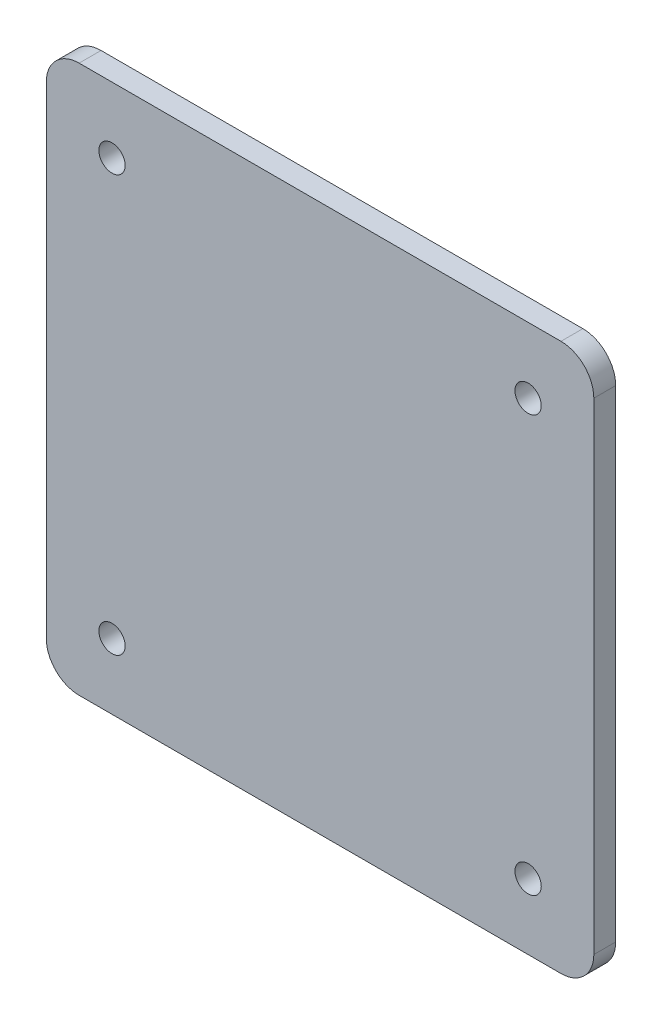
ISO-10303-21;
HEADER;
FILE_DESCRIPTION(('STEP AP214'),'2;1');
FILE_NAME('part.step','',(''),(''),'','','');
FILE_SCHEMA(('AUTOMOTIVE_DESIGN { 1 0 10303 214 1 1 1 1 }'));
ENDSEC;
DATA;
#1=APPLICATION_CONTEXT('core data for automotive mechanical design processes');
#2=APPLICATION_PROTOCOL_DEFINITION('international standard','automotive_design',2000,#1);
#3=PRODUCT_CONTEXT('',#1,'mechanical');
#4=PRODUCT('Part','Part','',(#3));
#5=PRODUCT_RELATED_PRODUCT_CATEGORY('part','',(#4));
#6=PRODUCT_DEFINITION_FORMATION('','',#4);
#7=PRODUCT_DEFINITION_CONTEXT('part definition',#1,'design');
#8=PRODUCT_DEFINITION('design','',#6,#7);
#9=PRODUCT_DEFINITION_SHAPE('','',#8);
#10=(LENGTH_UNIT() NAMED_UNIT(*) SI_UNIT(.MILLI.,.METRE.));
#11=(NAMED_UNIT(*) PLANE_ANGLE_UNIT() SI_UNIT($,.RADIAN.));
#12=(NAMED_UNIT(*) SI_UNIT($,.STERADIAN.) SOLID_ANGLE_UNIT());
#13=UNCERTAINTY_MEASURE_WITH_UNIT(LENGTH_MEASURE(1.E-05),#10,'distance_accuracy_value','');
#14=(GEOMETRIC_REPRESENTATION_CONTEXT(3) GLOBAL_UNCERTAINTY_ASSIGNED_CONTEXT((#13)) GLOBAL_UNIT_ASSIGNED_CONTEXT((#10,
#11,#12)) REPRESENTATION_CONTEXT('',''));
#15=CARTESIAN_POINT('',(0.,0.,0.));
#16=DIRECTION('',(0.,0.,1.));
#17=DIRECTION('',(1.,0.,0.));
#18=AXIS2_PLACEMENT_3D('',#15,#16,#17);
#19=CARTESIAN_POINT('',(110.,110.,10.));
#20=DIRECTION('',(0.,0.,-1.));
#21=DIRECTION('',(-1.,0.,0.));
#22=AXIS2_PLACEMENT_3D('',#19,#20,#21);
#23=PLANE('',#22);
#24=CARTESIAN_POINT('',(110.,110.,10.));
#25=DIRECTION('',(0.,0.,1.));
#26=DIRECTION('',(-1.,0.,0.));
#27=AXIS2_PLACEMENT_3D('',#24,#25,#26);
#28=CIRCLE('',#27,15.);
#29=CARTESIAN_POINT('',(125.,110.,10.));
#30=VERTEX_POINT('',#29);
#31=CARTESIAN_POINT('',(110.,125.,10.));
#32=VERTEX_POINT('',#31);
#33=EDGE_CURVE('E145',#30,#32,#28,.T.);
#34=ORIENTED_EDGE('',*,*,#33,.T.);
#35=DIRECTION('',(-1.,0.,0.));
#36=VECTOR('',#35,1.);
#37=CARTESIAN_POINT('',(-110.,125.,10.));
#38=LINE('',#37,#36);
#39=CARTESIAN_POINT('',(-110.,125.,10.));
#40=VERTEX_POINT('',#39);
#41=EDGE_CURVE('E93',#32,#40,#38,.T.);
#42=ORIENTED_EDGE('',*,*,#41,.T.);
#43=CARTESIAN_POINT('',(-110.,110.,10.));
#44=DIRECTION('',(0.,0.,1.));
#45=DIRECTION('',(1.,0.,0.));
#46=AXIS2_PLACEMENT_3D('',#43,#44,#45);
#47=CIRCLE('',#46,15.);
#48=CARTESIAN_POINT('',(-125.,110.,10.));
#49=VERTEX_POINT('',#48);
#50=EDGE_CURVE('E160',#40,#49,#47,.T.);
#51=ORIENTED_EDGE('',*,*,#50,.T.);
#52=DIRECTION('',(0.,-1.,0.));
#53=VECTOR('',#52,1.);
#54=CARTESIAN_POINT('',(-125.,110.,10.));
#55=LINE('',#54,#53);
#56=CARTESIAN_POINT('',(-125.,-110.,10.));
#57=VERTEX_POINT('',#56);
#58=EDGE_CURVE('E173',#49,#57,#55,.T.);
#59=ORIENTED_EDGE('',*,*,#58,.T.);
#60=CARTESIAN_POINT('',(-110.,-110.,10.));
#61=DIRECTION('',(0.,0.,1.));
#62=DIRECTION('',(1.,0.,0.));
#63=AXIS2_PLACEMENT_3D('',#60,#61,#62);
#64=CIRCLE('',#63,15.);
#65=CARTESIAN_POINT('',(-110.,-125.,10.));
#66=VERTEX_POINT('',#65);
#67=EDGE_CURVE('E112',#57,#66,#64,.T.);
#68=ORIENTED_EDGE('',*,*,#67,.T.);
#69=DIRECTION('',(1.,0.,0.));
#70=VECTOR('',#69,1.);
#71=CARTESIAN_POINT('',(-110.,-125.,10.));
#72=LINE('',#71,#70);
#73=CARTESIAN_POINT('',(110.,-125.,10.));
#74=VERTEX_POINT('',#73);
#75=EDGE_CURVE('E106',#66,#74,#72,.T.);
#76=ORIENTED_EDGE('',*,*,#75,.T.);
#77=CARTESIAN_POINT('',(110.,-110.,10.));
#78=DIRECTION('',(0.,0.,1.));
#79=DIRECTION('',(1.,0.,0.));
#80=AXIS2_PLACEMENT_3D('',#77,#78,#79);
#81=CIRCLE('',#80,15.);
#82=CARTESIAN_POINT('',(125.,-110.,10.));
#83=VERTEX_POINT('',#82);
#84=EDGE_CURVE('E110',#74,#83,#81,.T.);
#85=ORIENTED_EDGE('',*,*,#84,.T.);
#86=DIRECTION('',(0.,1.,0.));
#87=VECTOR('',#86,1.);
#88=CARTESIAN_POINT('',(125.,110.,10.));
#89=LINE('',#88,#87);
#90=EDGE_CURVE('E50',#83,#30,#89,.T.);
#91=ORIENTED_EDGE('',*,*,#90,.T.);
#92=EDGE_LOOP('',(#34,#42,#51,#59,#68,#76,#85,#91));
#93=FACE_BOUND('',#92,.T.);
#94=CARTESIAN_POINT('',(-95.,95.,10.));
#95=DIRECTION('',(0.,0.,1.));
#96=DIRECTION('',(1.,0.,0.));
#97=AXIS2_PLACEMENT_3D('',#94,#95,#96);
#98=CIRCLE('',#97,6.);
#99=CARTESIAN_POINT('',(-89.,95.,10.));
#100=VERTEX_POINT('',#99);
#101=EDGE_CURVE('E134',#100,#100,#98,.T.);
#102=ORIENTED_EDGE('',*,*,#101,.F.);
#103=EDGE_LOOP('',(#102));
#104=FACE_BOUND('',#103,.T.);
#105=CARTESIAN_POINT('',(-95.,-95.,10.));
#106=DIRECTION('',(0.,0.,1.));
#107=DIRECTION('',(1.,0.,0.));
#108=AXIS2_PLACEMENT_3D('',#105,#106,#107);
#109=CIRCLE('',#108,6.);
#110=CARTESIAN_POINT('',(-89.,-95.,10.));
#111=VERTEX_POINT('',#110);
#112=EDGE_CURVE('E182',#111,#111,#109,.T.);
#113=ORIENTED_EDGE('',*,*,#112,.F.);
#114=EDGE_LOOP('',(#113));
#115=FACE_BOUND('',#114,.T.);
#116=CARTESIAN_POINT('',(95.,-95.,10.));
#117=DIRECTION('',(0.,0.,1.));
#118=DIRECTION('',(1.,0.,0.));
#119=AXIS2_PLACEMENT_3D('',#116,#117,#118);
#120=CIRCLE('',#119,6.);
#121=CARTESIAN_POINT('',(101.,-95.,10.));
#122=VERTEX_POINT('',#121);
#123=EDGE_CURVE('E188',#122,#122,#120,.T.);
#124=ORIENTED_EDGE('',*,*,#123,.F.);
#125=EDGE_LOOP('',(#124));
#126=FACE_BOUND('',#125,.T.);
#127=CARTESIAN_POINT('',(95.,95.,10.));
#128=DIRECTION('',(0.,0.,1.));
#129=DIRECTION('',(1.,0.,0.));
#130=AXIS2_PLACEMENT_3D('',#127,#128,#129);
#131=CIRCLE('',#130,6.);
#132=CARTESIAN_POINT('',(101.,95.,10.));
#133=VERTEX_POINT('',#132);
#134=EDGE_CURVE('E194',#133,#133,#131,.T.);
#135=ORIENTED_EDGE('',*,*,#134,.F.);
#136=EDGE_LOOP('',(#135));
#137=FACE_BOUND('',#136,.T.);
#138=ADVANCED_FACE('F33',(#93,#104,#115,#126,#137),#23,.F.);
#139=CARTESIAN_POINT('',(110.,110.,0.));
#140=DIRECTION('',(0.,0.,-1.));
#141=DIRECTION('',(-1.,0.,0.));
#142=AXIS2_PLACEMENT_3D('',#139,#140,#141);
#143=PLANE('',#142);
#144=CARTESIAN_POINT('',(95.,-95.,0.));
#145=DIRECTION('',(0.,0.,1.));
#146=DIRECTION('',(1.,0.,0.));
#147=AXIS2_PLACEMENT_3D('',#144,#145,#146);
#148=CIRCLE('',#147,6.);
#149=CARTESIAN_POINT('',(101.,-95.,0.));
#150=VERTEX_POINT('',#149);
#151=EDGE_CURVE('E191',#150,#150,#148,.T.);
#152=ORIENTED_EDGE('',*,*,#151,.T.);
#153=EDGE_LOOP('',(#152));
#154=FACE_BOUND('',#153,.T.);
#155=CARTESIAN_POINT('',(-95.,95.,0.));
#156=DIRECTION('',(0.,0.,1.));
#157=DIRECTION('',(1.,0.,0.));
#158=AXIS2_PLACEMENT_3D('',#155,#156,#157);
#159=CIRCLE('',#158,6.);
#160=CARTESIAN_POINT('',(-89.,95.,0.));
#161=VERTEX_POINT('',#160);
#162=EDGE_CURVE('E179',#161,#161,#159,.T.);
#163=ORIENTED_EDGE('',*,*,#162,.T.);
#164=EDGE_LOOP('',(#163));
#165=FACE_BOUND('',#164,.T.);
#166=CARTESIAN_POINT('',(110.,110.,0.));
#167=DIRECTION('',(0.,0.,1.));
#168=DIRECTION('',(-1.,0.,0.));
#169=AXIS2_PLACEMENT_3D('',#166,#167,#168);
#170=CIRCLE('',#169,15.);
#171=CARTESIAN_POINT('',(125.,110.,0.));
#172=VERTEX_POINT('',#171);
#173=CARTESIAN_POINT('',(110.,125.,0.));
#174=VERTEX_POINT('',#173);
#175=EDGE_CURVE('E130',#172,#174,#170,.T.);
#176=ORIENTED_EDGE('',*,*,#175,.F.);
#177=DIRECTION('',(0.,1.,0.));
#178=VECTOR('',#177,1.);
#179=CARTESIAN_POINT('',(125.,110.,0.));
#180=LINE('',#179,#178);
#181=CARTESIAN_POINT('',(125.,-110.,0.));
#182=VERTEX_POINT('',#181);
#183=EDGE_CURVE('E85',#182,#172,#180,.T.);
#184=ORIENTED_EDGE('',*,*,#183,.F.);
#185=CARTESIAN_POINT('',(110.,-110.,0.));
#186=DIRECTION('',(0.,0.,1.));
#187=DIRECTION('',(1.,0.,0.));
#188=AXIS2_PLACEMENT_3D('',#185,#186,#187);
#189=CIRCLE('',#188,15.);
#190=CARTESIAN_POINT('',(110.,-125.,0.));
#191=VERTEX_POINT('',#190);
#192=EDGE_CURVE('E79',#191,#182,#189,.T.);
#193=ORIENTED_EDGE('',*,*,#192,.F.);
#194=DIRECTION('',(1.,0.,0.));
#195=VECTOR('',#194,1.);
#196=CARTESIAN_POINT('',(-110.,-125.,0.));
#197=LINE('',#196,#195);
#198=CARTESIAN_POINT('',(-110.,-125.,0.));
#199=VERTEX_POINT('',#198);
#200=EDGE_CURVE('E120',#199,#191,#197,.T.);
#201=ORIENTED_EDGE('',*,*,#200,.F.);
#202=CARTESIAN_POINT('',(-110.,-110.,0.));
#203=DIRECTION('',(0.,0.,1.));
#204=DIRECTION('',(1.,0.,0.));
#205=AXIS2_PLACEMENT_3D('',#202,#203,#204);
#206=CIRCLE('',#205,15.);
#207=CARTESIAN_POINT('',(-125.,-110.,0.));
#208=VERTEX_POINT('',#207);
#209=EDGE_CURVE('E140',#208,#199,#206,.T.);
#210=ORIENTED_EDGE('',*,*,#209,.F.);
#211=DIRECTION('',(0.,-1.,0.));
#212=VECTOR('',#211,1.);
#213=CARTESIAN_POINT('',(-125.,110.,0.));
#214=LINE('',#213,#212);
#215=CARTESIAN_POINT('',(-125.,110.,0.));
#216=VERTEX_POINT('',#215);
#217=EDGE_CURVE('E138',#216,#208,#214,.T.);
#218=ORIENTED_EDGE('',*,*,#217,.F.);
#219=CARTESIAN_POINT('',(-110.,110.,0.));
#220=DIRECTION('',(0.,0.,1.));
#221=DIRECTION('',(1.,0.,0.));
#222=AXIS2_PLACEMENT_3D('',#219,#220,#221);
#223=CIRCLE('',#222,15.);
#224=CARTESIAN_POINT('',(-110.,125.,0.));
#225=VERTEX_POINT('',#224);
#226=EDGE_CURVE('E136',#225,#216,#223,.T.);
#227=ORIENTED_EDGE('',*,*,#226,.F.);
#228=DIRECTION('',(-1.,0.,0.));
#229=VECTOR('',#228,1.);
#230=CARTESIAN_POINT('',(-110.,125.,0.));
#231=LINE('',#230,#229);
#232=EDGE_CURVE('E133',#174,#225,#231,.T.);
#233=ORIENTED_EDGE('',*,*,#232,.F.);
#234=EDGE_LOOP('',(#176,#184,#193,#201,#210,#218,#227,#233));
#235=FACE_BOUND('',#234,.T.);
#236=CARTESIAN_POINT('',(-95.,-95.,0.));
#237=DIRECTION('',(0.,0.,1.));
#238=DIRECTION('',(1.,0.,0.));
#239=AXIS2_PLACEMENT_3D('',#236,#237,#238);
#240=CIRCLE('',#239,6.);
#241=CARTESIAN_POINT('',(-89.,-95.,0.));
#242=VERTEX_POINT('',#241);
#243=EDGE_CURVE('E185',#242,#242,#240,.T.);
#244=ORIENTED_EDGE('',*,*,#243,.T.);
#245=EDGE_LOOP('',(#244));
#246=FACE_BOUND('',#245,.T.);
#247=CARTESIAN_POINT('',(95.,95.,0.));
#248=DIRECTION('',(0.,0.,1.));
#249=DIRECTION('',(1.,0.,0.));
#250=AXIS2_PLACEMENT_3D('',#247,#248,#249);
#251=CIRCLE('',#250,6.);
#252=CARTESIAN_POINT('',(101.,95.,0.));
#253=VERTEX_POINT('',#252);
#254=EDGE_CURVE('E197',#253,#253,#251,.T.);
#255=ORIENTED_EDGE('',*,*,#254,.T.);
#256=EDGE_LOOP('',(#255));
#257=FACE_BOUND('',#256,.T.);
#258=ADVANCED_FACE('F164',(#154,#165,#235,#246,#257),#143,.T.);
#259=CARTESIAN_POINT('',(110.,110.,10.));
#260=DIRECTION('',(0.,0.,-1.));
#261=DIRECTION('',(-1.,0.,0.));
#262=AXIS2_PLACEMENT_3D('',#259,#260,#261);
#263=CYLINDRICAL_SURFACE('',#262,15.);
#264=ORIENTED_EDGE('',*,*,#175,.T.);
#265=DIRECTION('',(0.,0.,-1.));
#266=VECTOR('',#265,1.);
#267=CARTESIAN_POINT('',(110.,125.,10.));
#268=LINE('',#267,#266);
#269=EDGE_CURVE('E11',#32,#174,#268,.T.);
#270=ORIENTED_EDGE('',*,*,#269,.F.);
#271=ORIENTED_EDGE('',*,*,#33,.F.);
#272=DIRECTION('',(0.,0.,-1.));
#273=VECTOR('',#272,1.);
#274=CARTESIAN_POINT('',(125.,110.,10.));
#275=LINE('',#274,#273);
#276=EDGE_CURVE('E126',#30,#172,#275,.T.);
#277=ORIENTED_EDGE('',*,*,#276,.T.);
#278=EDGE_LOOP('',(#264,#270,#271,#277));
#279=FACE_BOUND('',#278,.T.);
#280=ADVANCED_FACE('F35',(#279),#263,.T.);
#281=CARTESIAN_POINT('',(-110.,125.,10.));
#282=DIRECTION('',(0.,-1.,0.));
#283=DIRECTION('',(0.,0.,-1.));
#284=AXIS2_PLACEMENT_3D('',#281,#282,#283);
#285=PLANE('',#284);
#286=ORIENTED_EDGE('',*,*,#232,.T.);
#287=DIRECTION('',(0.,0.,-1.));
#288=VECTOR('',#287,1.);
#289=CARTESIAN_POINT('',(-110.,125.,10.));
#290=LINE('',#289,#288);
#291=EDGE_CURVE('E42',#40,#225,#290,.T.);
#292=ORIENTED_EDGE('',*,*,#291,.F.);
#293=ORIENTED_EDGE('',*,*,#41,.F.);
#294=ORIENTED_EDGE('',*,*,#269,.T.);
#295=EDGE_LOOP('',(#286,#292,#293,#294));
#296=FACE_BOUND('',#295,.T.);
#297=ADVANCED_FACE('F229',(#296),#285,.F.);
#298=CARTESIAN_POINT('',(-110.,110.,10.));
#299=DIRECTION('',(0.,0.,-1.));
#300=DIRECTION('',(-1.,0.,0.));
#301=AXIS2_PLACEMENT_3D('',#298,#299,#300);
#302=CYLINDRICAL_SURFACE('',#301,15.);
#303=ORIENTED_EDGE('',*,*,#226,.T.);
#304=DIRECTION('',(0.,0.,-1.));
#305=VECTOR('',#304,1.);
#306=CARTESIAN_POINT('',(-125.,110.,10.));
#307=LINE('',#306,#305);
#308=EDGE_CURVE('E152',#49,#216,#307,.T.);
#309=ORIENTED_EDGE('',*,*,#308,.F.);
#310=ORIENTED_EDGE('',*,*,#50,.F.);
#311=ORIENTED_EDGE('',*,*,#291,.T.);
#312=EDGE_LOOP('',(#303,#309,#310,#311));
#313=FACE_BOUND('',#312,.T.);
#314=ADVANCED_FACE('F158',(#313),#302,.T.);
#315=CARTESIAN_POINT('',(-125.,110.,10.));
#316=DIRECTION('',(1.,0.,0.));
#317=DIRECTION('',(0.,1.,0.));
#318=AXIS2_PLACEMENT_3D('',#315,#316,#317);
#319=PLANE('',#318);
#320=ORIENTED_EDGE('',*,*,#217,.T.);
#321=DIRECTION('',(0.,0.,-1.));
#322=VECTOR('',#321,1.);
#323=CARTESIAN_POINT('',(-125.,-110.,10.));
#324=LINE('',#323,#322);
#325=EDGE_CURVE('E149',#57,#208,#324,.T.);
#326=ORIENTED_EDGE('',*,*,#325,.F.);
#327=ORIENTED_EDGE('',*,*,#58,.F.);
#328=ORIENTED_EDGE('',*,*,#308,.T.);
#329=EDGE_LOOP('',(#320,#326,#327,#328));
#330=FACE_BOUND('',#329,.T.);
#331=ADVANCED_FACE('F169',(#330),#319,.F.);
#332=CARTESIAN_POINT('',(-110.,-110.,10.));
#333=DIRECTION('',(0.,0.,-1.));
#334=DIRECTION('',(-1.,0.,0.));
#335=AXIS2_PLACEMENT_3D('',#332,#333,#334);
#336=CYLINDRICAL_SURFACE('',#335,15.);
#337=ORIENTED_EDGE('',*,*,#209,.T.);
#338=DIRECTION('',(0.,0.,-1.));
#339=VECTOR('',#338,1.);
#340=CARTESIAN_POINT('',(-110.,-125.,10.));
#341=LINE('',#340,#339);
#342=EDGE_CURVE('E121',#66,#199,#341,.T.);
#343=ORIENTED_EDGE('',*,*,#342,.F.);
#344=ORIENTED_EDGE('',*,*,#67,.F.);
#345=ORIENTED_EDGE('',*,*,#325,.T.);
#346=EDGE_LOOP('',(#337,#343,#344,#345));
#347=FACE_BOUND('',#346,.T.);
#348=ADVANCED_FACE('F172',(#347),#336,.T.);
#349=CARTESIAN_POINT('',(-110.,-125.,10.));
#350=DIRECTION('',(0.,1.,0.));
#351=DIRECTION('',(0.,0.,1.));
#352=AXIS2_PLACEMENT_3D('',#349,#350,#351);
#353=PLANE('',#352);
#354=ORIENTED_EDGE('',*,*,#200,.T.);
#355=DIRECTION('',(0.,0.,-1.));
#356=VECTOR('',#355,1.);
#357=CARTESIAN_POINT('',(110.,-125.,10.));
#358=LINE('',#357,#356);
#359=EDGE_CURVE('E117',#74,#191,#358,.T.);
#360=ORIENTED_EDGE('',*,*,#359,.F.);
#361=ORIENTED_EDGE('',*,*,#75,.F.);
#362=ORIENTED_EDGE('',*,*,#342,.T.);
#363=EDGE_LOOP('',(#354,#360,#361,#362));
#364=FACE_BOUND('',#363,.T.);
#365=ADVANCED_FACE('F118',(#364),#353,.F.);
#366=CARTESIAN_POINT('',(110.,-110.,10.));
#367=DIRECTION('',(0.,0.,-1.));
#368=DIRECTION('',(-1.,0.,0.));
#369=AXIS2_PLACEMENT_3D('',#366,#367,#368);
#370=CYLINDRICAL_SURFACE('',#369,15.);
#371=ORIENTED_EDGE('',*,*,#192,.T.);
#372=DIRECTION('',(0.,0.,-1.));
#373=VECTOR('',#372,1.);
#374=CARTESIAN_POINT('',(125.,-110.,10.));
#375=LINE('',#374,#373);
#376=EDGE_CURVE('E122',#83,#182,#375,.T.);
#377=ORIENTED_EDGE('',*,*,#376,.F.);
#378=ORIENTED_EDGE('',*,*,#84,.F.);
#379=ORIENTED_EDGE('',*,*,#359,.T.);
#380=EDGE_LOOP('',(#371,#377,#378,#379));
#381=FACE_BOUND('',#380,.T.);
#382=ADVANCED_FACE('F124',(#381),#370,.T.);
#383=CARTESIAN_POINT('',(125.,110.,10.));
#384=DIRECTION('',(-1.,0.,0.));
#385=DIRECTION('',(0.,-1.,0.));
#386=AXIS2_PLACEMENT_3D('',#383,#384,#385);
#387=PLANE('',#386);
#388=ORIENTED_EDGE('',*,*,#183,.T.);
#389=ORIENTED_EDGE('',*,*,#276,.F.);
#390=ORIENTED_EDGE('',*,*,#90,.F.);
#391=ORIENTED_EDGE('',*,*,#376,.T.);
#392=EDGE_LOOP('',(#388,#389,#390,#391));
#393=FACE_BOUND('',#392,.T.);
#394=ADVANCED_FACE('F217',(#393),#387,.F.);
#395=CARTESIAN_POINT('',(-95.,95.,10.));
#396=DIRECTION('',(0.,0.,-1.));
#397=DIRECTION('',(-1.,0.,0.));
#398=AXIS2_PLACEMENT_3D('',#395,#396,#397);
#399=CYLINDRICAL_SURFACE('',#398,6.);
#400=ORIENTED_EDGE('',*,*,#101,.T.);
#401=EDGE_LOOP('',(#400));
#402=FACE_BOUND('',#401,.T.);
#403=ORIENTED_EDGE('',*,*,#162,.F.);
#404=EDGE_LOOP('',(#403));
#405=FACE_BOUND('',#404,.T.);
#406=ADVANCED_FACE('F214',(#402,#405),#399,.F.);
#407=CARTESIAN_POINT('',(-95.,-95.,10.));
#408=DIRECTION('',(0.,0.,-1.));
#409=DIRECTION('',(-1.,0.,0.));
#410=AXIS2_PLACEMENT_3D('',#407,#408,#409);
#411=CYLINDRICAL_SURFACE('',#410,6.);
#412=ORIENTED_EDGE('',*,*,#112,.T.);
#413=EDGE_LOOP('',(#412));
#414=FACE_BOUND('',#413,.T.);
#415=ORIENTED_EDGE('',*,*,#243,.F.);
#416=EDGE_LOOP('',(#415));
#417=FACE_BOUND('',#416,.T.);
#418=ADVANCED_FACE('F293',(#414,#417),#411,.F.);
#419=CARTESIAN_POINT('',(95.,-95.,10.));
#420=DIRECTION('',(0.,0.,-1.));
#421=DIRECTION('',(-1.,0.,0.));
#422=AXIS2_PLACEMENT_3D('',#419,#420,#421);
#423=CYLINDRICAL_SURFACE('',#422,6.);
#424=ORIENTED_EDGE('',*,*,#123,.T.);
#425=EDGE_LOOP('',(#424));
#426=FACE_BOUND('',#425,.T.);
#427=ORIENTED_EDGE('',*,*,#151,.F.);
#428=EDGE_LOOP('',(#427));
#429=FACE_BOUND('',#428,.T.);
#430=ADVANCED_FACE('F301',(#426,#429),#423,.F.);
#431=CARTESIAN_POINT('',(95.,95.,10.));
#432=DIRECTION('',(0.,0.,-1.));
#433=DIRECTION('',(-1.,0.,0.));
#434=AXIS2_PLACEMENT_3D('',#431,#432,#433);
#435=CYLINDRICAL_SURFACE('',#434,6.);
#436=ORIENTED_EDGE('',*,*,#134,.T.);
#437=EDGE_LOOP('',(#436));
#438=FACE_BOUND('',#437,.T.);
#439=ORIENTED_EDGE('',*,*,#254,.F.);
#440=EDGE_LOOP('',(#439));
#441=FACE_BOUND('',#440,.T.);
#442=ADVANCED_FACE('F203',(#438,#441),#435,.F.);
#443=CLOSED_SHELL('',(#138,#258,#280,#297,#314,#331,#348,#365,#382,#394,#406,#418,#430,#442));
#444=MANIFOLD_SOLID_BREP('B2',#443);
#445=ADVANCED_BREP_SHAPE_REPRESENTATION('',(#18,#444),#14);
#446=SHAPE_DEFINITION_REPRESENTATION(#9,#445);
ENDSEC;
END-ISO-10303-21;
